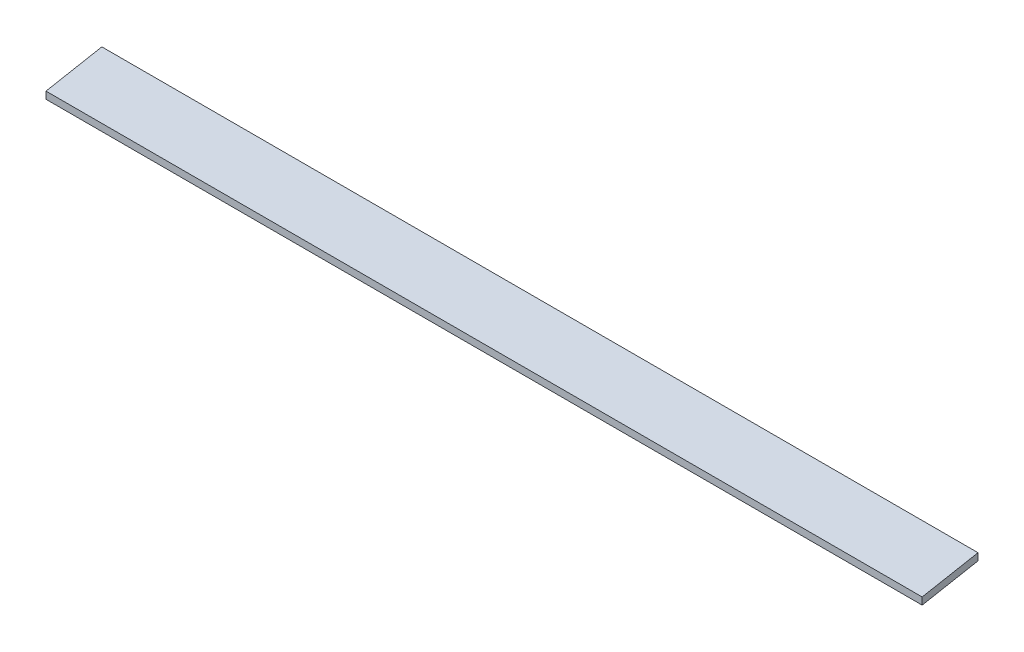
ISO-10303-21;
HEADER;
FILE_DESCRIPTION(('STEP AP214'),'2;1');
FILE_NAME('part.step','',(''),(''),'','','');
FILE_SCHEMA(('AUTOMOTIVE_DESIGN { 1 0 10303 214 1 1 1 1 }'));
ENDSEC;
DATA;
#1=APPLICATION_CONTEXT('core data for automotive mechanical design processes');
#2=APPLICATION_PROTOCOL_DEFINITION('international standard','automotive_design',2000,#1);
#3=PRODUCT_CONTEXT('',#1,'mechanical');
#4=PRODUCT('Part','Part','',(#3));
#5=PRODUCT_RELATED_PRODUCT_CATEGORY('part','',(#4));
#6=PRODUCT_DEFINITION_FORMATION('','',#4);
#7=PRODUCT_DEFINITION_CONTEXT('part definition',#1,'design');
#8=PRODUCT_DEFINITION('design','',#6,#7);
#9=PRODUCT_DEFINITION_SHAPE('','',#8);
#10=(LENGTH_UNIT() NAMED_UNIT(*) SI_UNIT(.MILLI.,.METRE.));
#11=(NAMED_UNIT(*) PLANE_ANGLE_UNIT() SI_UNIT($,.RADIAN.));
#12=(NAMED_UNIT(*) SI_UNIT($,.STERADIAN.) SOLID_ANGLE_UNIT());
#13=UNCERTAINTY_MEASURE_WITH_UNIT(LENGTH_MEASURE(1.E-05),#10,'distance_accuracy_value','');
#14=(GEOMETRIC_REPRESENTATION_CONTEXT(3) GLOBAL_UNCERTAINTY_ASSIGNED_CONTEXT((#13)) GLOBAL_UNIT_ASSIGNED_CONTEXT((#10,
#11,#12)) REPRESENTATION_CONTEXT('',''));
#15=CARTESIAN_POINT('',(0.,0.,0.));
#16=DIRECTION('',(0.,0.,1.));
#17=DIRECTION('',(1.,0.,0.));
#18=AXIS2_PLACEMENT_3D('',#15,#16,#17);
#19=CARTESIAN_POINT('',(6170.,62.5167255365538,-337.991902915567));
#20=DIRECTION('',(0.,0.,1.));
#21=DIRECTION('',(1.,0.,0.));
#22=AXIS2_PLACEMENT_3D('',#19,#20,#21);
#23=PLANE('',#22);
#24=DIRECTION('',(0.,1.,0.));
#25=VECTOR('',#24,1.);
#26=CARTESIAN_POINT('',(0.,62.5167255365538,-337.991902915567));
#27=LINE('',#26,#25);
#28=CARTESIAN_POINT('',(0.,62.5167255365538,-337.991902915567));
#29=VERTEX_POINT('',#28);
#30=CARTESIAN_POINT('',(0.,112.516725536554,-337.991902915567));
#31=VERTEX_POINT('',#30);
#32=EDGE_CURVE('E98',#29,#31,#27,.T.);
#33=ORIENTED_EDGE('',*,*,#32,.T.);
#34=DIRECTION('',(-1.,0.,0.));
#35=VECTOR('',#34,1.);
#36=CARTESIAN_POINT('',(6170.,112.516725536554,-337.991902915567));
#37=LINE('',#36,#35);
#38=CARTESIAN_POINT('',(6170.,112.516725536554,-337.991902915567));
#39=VERTEX_POINT('',#38);
#40=EDGE_CURVE('E11',#39,#31,#37,.T.);
#41=ORIENTED_EDGE('',*,*,#40,.F.);
#42=DIRECTION('',(0.,1.,0.));
#43=VECTOR('',#42,1.);
#44=CARTESIAN_POINT('',(6170.,62.5167255365538,-337.991902915567));
#45=LINE('',#44,#43);
#46=CARTESIAN_POINT('',(6170.,62.5167255365538,-337.991902915567));
#47=VERTEX_POINT('',#46);
#48=EDGE_CURVE('E86',#47,#39,#45,.T.);
#49=ORIENTED_EDGE('',*,*,#48,.F.);
#50=DIRECTION('',(-1.,0.,0.));
#51=VECTOR('',#50,1.);
#52=CARTESIAN_POINT('',(6170.,62.5167255365538,-337.991902915567));
#53=LINE('',#52,#51);
#54=EDGE_CURVE('E94',#47,#29,#53,.T.);
#55=ORIENTED_EDGE('',*,*,#54,.T.);
#56=EDGE_LOOP('',(#33,#41,#49,#55));
#57=FACE_BOUND('',#56,.T.);
#58=ADVANCED_FACE('F35',(#57),#23,.F.);
#59=CARTESIAN_POINT('',(6170.,112.516725536554,-337.991902915567));
#60=DIRECTION('',(0.,-0.983076054762301,-0.183197899968828));
#61=DIRECTION('',(0.,0.183197899968828,-0.983076054762301));
#62=AXIS2_PLACEMENT_3D('',#59,#60,#61);
#63=PLANE('',#62);
#64=DIRECTION('',(0.,-0.183197899968828,0.983076054762301));
#65=VECTOR('',#64,1.);
#66=CARTESIAN_POINT('',(0.,112.516725536554,-337.991902915567));
#67=LINE('',#66,#65);
#68=CARTESIAN_POINT('',(0.,39.2375655490227,55.2385189893533));
#69=VERTEX_POINT('',#68);
#70=EDGE_CURVE('E90',#31,#69,#67,.T.);
#71=ORIENTED_EDGE('',*,*,#70,.T.);
#72=DIRECTION('',(-1.,0.,0.));
#73=VECTOR('',#72,1.);
#74=CARTESIAN_POINT('',(6170.,39.2375655490227,55.2385189893533));
#75=LINE('',#74,#73);
#76=CARTESIAN_POINT('',(6170.,39.2375655490227,55.2385189893533));
#77=VERTEX_POINT('',#76);
#78=EDGE_CURVE('E43',#77,#69,#75,.T.);
#79=ORIENTED_EDGE('',*,*,#78,.F.);
#80=DIRECTION('',(0.,-0.183197899968828,0.983076054762301));
#81=VECTOR('',#80,1.);
#82=CARTESIAN_POINT('',(6170.,112.516725536554,-337.991902915567));
#83=LINE('',#82,#81);
#84=EDGE_CURVE('E81',#39,#77,#83,.T.);
#85=ORIENTED_EDGE('',*,*,#84,.F.);
#86=ORIENTED_EDGE('',*,*,#40,.T.);
#87=EDGE_LOOP('',(#71,#79,#85,#86));
#88=FACE_BOUND('',#87,.T.);
#89=ADVANCED_FACE('F89',(#88),#63,.F.);
#90=CARTESIAN_POINT('',(6170.,39.2375655490227,55.2385189893533));
#91=DIRECTION('',(0.,0.,-1.));
#92=DIRECTION('',(0.,1.,0.));
#93=AXIS2_PLACEMENT_3D('',#90,#91,#92);
#94=PLANE('',#93);
#95=DIRECTION('',(0.,-1.,0.));
#96=VECTOR('',#95,1.);
#97=CARTESIAN_POINT('',(0.,39.2375655490227,55.2385189893533));
#98=LINE('',#97,#96);
#99=CARTESIAN_POINT('',(0.,-10.7624344509773,55.2385189893533));
#100=VERTEX_POINT('',#99);
#101=EDGE_CURVE('E68',#69,#100,#98,.T.);
#102=ORIENTED_EDGE('',*,*,#101,.T.);
#103=DIRECTION('',(-1.,0.,0.));
#104=VECTOR('',#103,1.);
#105=CARTESIAN_POINT('',(6170.,-10.7624344509773,55.2385189893533));
#106=LINE('',#105,#104);
#107=CARTESIAN_POINT('',(6170.,-10.7624344509773,55.2385189893533));
#108=VERTEX_POINT('',#107);
#109=EDGE_CURVE('E91',#108,#100,#106,.T.);
#110=ORIENTED_EDGE('',*,*,#109,.F.);
#111=DIRECTION('',(0.,-1.,0.));
#112=VECTOR('',#111,1.);
#113=CARTESIAN_POINT('',(6170.,39.2375655490227,55.2385189893533));
#114=LINE('',#113,#112);
#115=EDGE_CURVE('E84',#77,#108,#114,.T.);
#116=ORIENTED_EDGE('',*,*,#115,.F.);
#117=ORIENTED_EDGE('',*,*,#78,.T.);
#118=EDGE_LOOP('',(#102,#110,#116,#117));
#119=FACE_BOUND('',#118,.T.);
#120=ADVANCED_FACE('F92',(#119),#94,.F.);
#121=CARTESIAN_POINT('',(6170.,-10.7624344509773,55.2385189893533));
#122=DIRECTION('',(0.,0.983076054762301,0.183197899968828));
#123=DIRECTION('',(0.,-0.183197899968828,0.983076054762301));
#124=AXIS2_PLACEMENT_3D('',#121,#122,#123);
#125=PLANE('',#124);
#126=DIRECTION('',(0.,0.183197899968828,-0.983076054762301));
#127=VECTOR('',#126,1.);
#128=CARTESIAN_POINT('',(0.,-10.7624344509773,55.2385189893533));
#129=LINE('',#128,#127);
#130=EDGE_CURVE('E74',#100,#29,#129,.T.);
#131=ORIENTED_EDGE('',*,*,#130,.T.);
#132=ORIENTED_EDGE('',*,*,#54,.F.);
#133=DIRECTION('',(0.,0.183197899968828,-0.983076054762301));
#134=VECTOR('',#133,1.);
#135=CARTESIAN_POINT('',(6170.,-10.7624344509773,55.2385189893533));
#136=LINE('',#135,#134);
#137=EDGE_CURVE('E51',#108,#47,#136,.T.);
#138=ORIENTED_EDGE('',*,*,#137,.F.);
#139=ORIENTED_EDGE('',*,*,#109,.T.);
#140=EDGE_LOOP('',(#131,#132,#138,#139));
#141=FACE_BOUND('',#140,.T.);
#142=ADVANCED_FACE('F105',(#141),#125,.F.);
#143=CARTESIAN_POINT('',(6170.,0.,0.));
#144=DIRECTION('',(1.,0.,0.));
#145=DIRECTION('',(0.,0.,-1.));
#146=AXIS2_PLACEMENT_3D('',#143,#144,#145);
#147=PLANE('',#146);
#148=ORIENTED_EDGE('',*,*,#48,.T.);
#149=ORIENTED_EDGE('',*,*,#84,.T.);
#150=ORIENTED_EDGE('',*,*,#115,.T.);
#151=ORIENTED_EDGE('',*,*,#137,.T.);
#152=EDGE_LOOP('',(#148,#149,#150,#151));
#153=FACE_BOUND('',#152,.T.);
#154=ADVANCED_FACE('F82',(#153),#147,.T.);
#155=CARTESIAN_POINT('',(0.,0.,0.));
#156=DIRECTION('',(1.,0.,0.));
#157=DIRECTION('',(0.,0.,-1.));
#158=AXIS2_PLACEMENT_3D('',#155,#156,#157);
#159=PLANE('',#158);
#160=ORIENTED_EDGE('',*,*,#32,.F.);
#161=ORIENTED_EDGE('',*,*,#130,.F.);
#162=ORIENTED_EDGE('',*,*,#101,.F.);
#163=ORIENTED_EDGE('',*,*,#70,.F.);
#164=EDGE_LOOP('',(#160,#161,#162,#163));
#165=FACE_BOUND('',#164,.T.);
#166=ADVANCED_FACE('F108',(#165),#159,.F.);
#167=CLOSED_SHELL('',(#58,#89,#120,#142,#154,#166));
#168=MANIFOLD_SOLID_BREP('B2',#167);
#169=ADVANCED_BREP_SHAPE_REPRESENTATION('',(#18,#168),#14);
#170=SHAPE_DEFINITION_REPRESENTATION(#9,#169);
ENDSEC;
END-ISO-10303-21;
